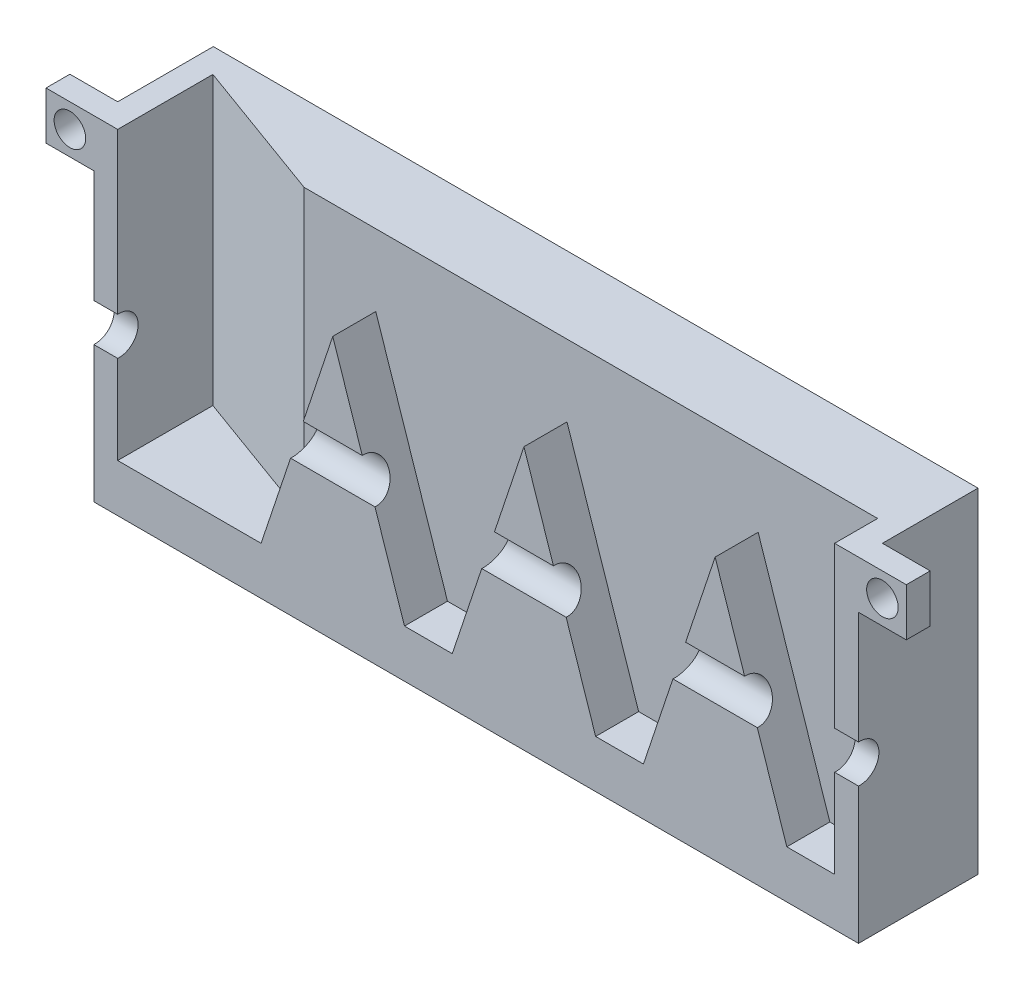
ISO-10303-21;
HEADER;
FILE_DESCRIPTION(('STEP AP214'),'2;1');
FILE_NAME('part.step','',(''),(''),'','','');
FILE_SCHEMA(('AUTOMOTIVE_DESIGN { 1 0 10303 214 1 1 1 1 }'));
ENDSEC;
DATA;
#1=APPLICATION_CONTEXT('core data for automotive mechanical design processes');
#2=APPLICATION_PROTOCOL_DEFINITION('international standard','automotive_design',2000,#1);
#3=PRODUCT_CONTEXT('',#1,'mechanical');
#4=PRODUCT('Part','Part','',(#3));
#5=PRODUCT_RELATED_PRODUCT_CATEGORY('part','',(#4));
#6=PRODUCT_DEFINITION_FORMATION('','',#4);
#7=PRODUCT_DEFINITION_CONTEXT('part definition',#1,'design');
#8=PRODUCT_DEFINITION('design','',#6,#7);
#9=PRODUCT_DEFINITION_SHAPE('','',#8);
#10=(LENGTH_UNIT() NAMED_UNIT(*) SI_UNIT(.MILLI.,.METRE.));
#11=(NAMED_UNIT(*) PLANE_ANGLE_UNIT() SI_UNIT($,.RADIAN.));
#12=(NAMED_UNIT(*) SI_UNIT($,.STERADIAN.) SOLID_ANGLE_UNIT());
#13=UNCERTAINTY_MEASURE_WITH_UNIT(LENGTH_MEASURE(1.E-05),#10,'distance_accuracy_value','');
#14=(GEOMETRIC_REPRESENTATION_CONTEXT(3) GLOBAL_UNCERTAINTY_ASSIGNED_CONTEXT((#13)) GLOBAL_UNIT_ASSIGNED_CONTEXT((#10,
#11,#12)) REPRESENTATION_CONTEXT('',''));
#15=CARTESIAN_POINT('',(0.,0.,0.));
#16=DIRECTION('',(0.,0.,1.));
#17=DIRECTION('',(1.,0.,0.));
#18=AXIS2_PLACEMENT_3D('',#15,#16,#17);
#19=CARTESIAN_POINT('',(0.,0.,-12.5));
#20=DIRECTION('',(0.,0.,-1.));
#21=DIRECTION('',(-1.,0.,0.));
#22=AXIS2_PLACEMENT_3D('',#19,#20,#21);
#23=PLANE('',#22);
#24=DIRECTION('',(-1.,0.,0.));
#25=VECTOR('',#24,1.);
#26=CARTESIAN_POINT('',(85.6568542494924,18.2453215446064,-12.5));
#27=LINE('',#26,#25);
#28=CARTESIAN_POINT('',(48.0848928184645,18.2453215446064,-12.5));
#29=VERTEX_POINT('',#28);
#30=CARTESIAN_POINT('',(41.9151071815355,18.2453215446064,-12.5));
#31=VERTEX_POINT('',#30);
#32=EDGE_CURVE('E438',#29,#31,#27,.T.);
#33=ORIENTED_EDGE('',*,*,#32,.F.);
#34=DIRECTION('',(0.316227766016838,-0.948683298050514,0.));
#35=VECTOR('',#34,1.);
#36=CARTESIAN_POINT('',(52.5,5.00000000000001,-12.5));
#37=LINE('',#36,#35);
#38=CARTESIAN_POINT('',(45.,27.5,-12.5));
#39=VERTEX_POINT('',#38);
#40=EDGE_CURVE('E462',#39,#29,#37,.T.);
#41=ORIENTED_EDGE('',*,*,#40,.F.);
#42=DIRECTION('',(0.316227766016838,0.948683298050514,0.));
#43=VECTOR('',#42,1.);
#44=CARTESIAN_POINT('',(45.,27.5,-12.5));
#45=LINE('',#44,#43);
#46=EDGE_CURVE('E454',#31,#39,#45,.T.);
#47=ORIENTED_EDGE('',*,*,#46,.F.);
#48=EDGE_LOOP('',(#33,#41,#47));
#49=FACE_BOUND('',#48,.T.);
#50=ADVANCED_FACE('F34',(#49),#23,.F.);
#51=DIRECTION('',(-1.,0.,0.));
#52=VECTOR('',#51,1.);
#53=CARTESIAN_POINT('',(85.6568542494924,18.2453215446064,-12.5));
#54=LINE('',#53,#52);
#55=CARTESIAN_POINT('',(28.0848928184645,18.2453215446064,-12.5));
#56=VERTEX_POINT('',#55);
#57=CARTESIAN_POINT('',(21.9151071815355,18.2453215446064,-12.5));
#58=VERTEX_POINT('',#57);
#59=EDGE_CURVE('E439',#56,#58,#54,.T.);
#60=ORIENTED_EDGE('',*,*,#59,.F.);
#61=DIRECTION('',(0.316227766016838,-0.948683298050514,0.));
#62=VECTOR('',#61,1.);
#63=CARTESIAN_POINT('',(32.5,5.00000000000001,-12.5));
#64=LINE('',#63,#62);
#65=CARTESIAN_POINT('',(25.,27.5,-12.5));
#66=VERTEX_POINT('',#65);
#67=EDGE_CURVE('E440',#66,#56,#64,.T.);
#68=ORIENTED_EDGE('',*,*,#67,.F.);
#69=DIRECTION('',(0.316227766016838,0.948683298050514,0.));
#70=VECTOR('',#69,1.);
#71=CARTESIAN_POINT('',(25.,27.5,-12.5));
#72=LINE('',#71,#70);
#73=EDGE_CURVE('E427',#58,#66,#72,.T.);
#74=ORIENTED_EDGE('',*,*,#73,.F.);
#75=EDGE_LOOP('',(#60,#68,#74));
#76=FACE_BOUND('',#75,.T.);
#77=ADVANCED_FACE('F532',(#76),#23,.F.);
#78=DIRECTION('',(-1.,0.,0.));
#79=VECTOR('',#78,1.);
#80=CARTESIAN_POINT('',(85.6568542494924,18.2453215446064,-12.5));
#81=LINE('',#80,#79);
#82=CARTESIAN_POINT('',(68.0848928184645,18.2453215446064,-12.5));
#83=VERTEX_POINT('',#82);
#84=CARTESIAN_POINT('',(61.9151071815355,18.2453215446064,-12.5));
#85=VERTEX_POINT('',#84);
#86=EDGE_CURVE('E435',#83,#85,#81,.T.);
#87=ORIENTED_EDGE('',*,*,#86,.F.);
#88=DIRECTION('',(0.316227766016838,-0.948683298050514,0.));
#89=VECTOR('',#88,1.);
#90=CARTESIAN_POINT('',(72.5,5.00000000000001,-12.5));
#91=LINE('',#90,#89);
#92=CARTESIAN_POINT('',(65.,27.5,-12.5));
#93=VERTEX_POINT('',#92);
#94=EDGE_CURVE('E455',#93,#83,#91,.T.);
#95=ORIENTED_EDGE('',*,*,#94,.F.);
#96=DIRECTION('',(0.316227766016838,0.948683298050514,0.));
#97=VECTOR('',#96,1.);
#98=CARTESIAN_POINT('',(65.,27.5,-12.5));
#99=LINE('',#98,#97);
#100=EDGE_CURVE('E457',#85,#93,#99,.T.);
#101=ORIENTED_EDGE('',*,*,#100,.F.);
#102=EDGE_LOOP('',(#87,#95,#101));
#103=FACE_BOUND('',#102,.T.);
#104=ADVANCED_FACE('F538',(#103),#23,.F.);
#105=CARTESIAN_POINT('',(82.5,32.5,-12.5));
#106=DIRECTION('',(0.,0.,-1.));
#107=DIRECTION('',(-1.,0.,0.));
#108=AXIS2_PLACEMENT_3D('',#105,#106,#107);
#109=CIRCLE('',#108,1.65);
#110=CARTESIAN_POINT('',(80.85,32.5,-12.5));
#111=VERTEX_POINT('',#110);
#112=EDGE_CURVE('E11',#111,#111,#109,.T.);
#113=ORIENTED_EDGE('',*,*,#112,.T.);
#114=EDGE_LOOP('',(#113));
#115=FACE_BOUND('',#114,.T.);
#116=DIRECTION('',(1.,0.,0.));
#117=VECTOR('',#116,1.);
#118=CARTESIAN_POINT('',(85.,30.,-12.5));
#119=LINE('',#118,#117);
#120=CARTESIAN_POINT('',(80.,30.,-12.5));
#121=VERTEX_POINT('',#120);
#122=CARTESIAN_POINT('',(85.,30.,-12.5));
#123=VERTEX_POINT('',#122);
#124=EDGE_CURVE('E416',#121,#123,#119,.T.);
#125=ORIENTED_EDGE('',*,*,#124,.T.);
#126=DIRECTION('',(0.,1.,0.));
#127=VECTOR('',#126,1.);
#128=CARTESIAN_POINT('',(85.,0.,-12.5));
#129=LINE('',#128,#127);
#130=CARTESIAN_POINT('',(85.,35.,-12.5));
#131=VERTEX_POINT('',#130);
#132=EDGE_CURVE('E43',#123,#131,#129,.T.);
#133=ORIENTED_EDGE('',*,*,#132,.T.);
#134=DIRECTION('',(1.,0.,0.));
#135=VECTOR('',#134,1.);
#136=CARTESIAN_POINT('',(0.,35.,-12.5));
#137=LINE('',#136,#135);
#138=CARTESIAN_POINT('',(77.5,35.,-12.5));
#139=VERTEX_POINT('',#138);
#140=EDGE_CURVE('E50',#139,#131,#137,.T.);
#141=ORIENTED_EDGE('',*,*,#140,.F.);
#142=DIRECTION('',(0.,-1.,0.));
#143=VECTOR('',#142,1.);
#144=CARTESIAN_POINT('',(77.5,5.00000000000001,-12.5));
#145=LINE('',#144,#143);
#146=CARTESIAN_POINT('',(77.5,18.2453215446064,-12.5));
#147=VERTEX_POINT('',#146);
#148=EDGE_CURVE('E445',#139,#147,#145,.T.);
#149=ORIENTED_EDGE('',*,*,#148,.T.);
#150=DIRECTION('',(-1.,0.,0.));
#151=VECTOR('',#150,1.);
#152=CARTESIAN_POINT('',(85.6568542494924,18.2453215446064,-12.5));
#153=LINE('',#152,#151);
#154=CARTESIAN_POINT('',(80.,18.2453215446064,-12.5));
#155=VERTEX_POINT('',#154);
#156=EDGE_CURVE('E401',#155,#147,#153,.T.);
#157=ORIENTED_EDGE('',*,*,#156,.F.);
#158=DIRECTION('',(0.,-1.,0.));
#159=VECTOR('',#158,1.);
#160=CARTESIAN_POINT('',(80.,35.,-12.5));
#161=LINE('',#160,#159);
#162=EDGE_CURVE('E430',#121,#155,#161,.T.);
#163=ORIENTED_EDGE('',*,*,#162,.F.);
#164=EDGE_LOOP('',(#125,#133,#141,#149,#157,#163));
#165=FACE_BOUND('',#164,.T.);
#166=ADVANCED_FACE('F551',(#115,#165),#23,.F.);
#167=DIRECTION('',(-1.,0.,0.));
#168=VECTOR('',#167,1.);
#169=CARTESIAN_POINT('',(77.5,5.00000000000001,-12.5));
#170=LINE('',#169,#168);
#171=CARTESIAN_POINT('',(57.5,5.00000000000001,-12.5));
#172=VERTEX_POINT('',#171);
#173=CARTESIAN_POINT('',(52.5,5.00000000000001,-12.5));
#174=VERTEX_POINT('',#173);
#175=EDGE_CURVE('E449',#172,#174,#170,.T.);
#176=ORIENTED_EDGE('',*,*,#175,.T.);
#177=CARTESIAN_POINT('',(49.4151071815355,14.2546784553936,-12.5));
#178=VERTEX_POINT('',#177);
#179=EDGE_CURVE('E420',#178,#174,#37,.T.);
#180=ORIENTED_EDGE('',*,*,#179,.F.);
#181=DIRECTION('',(-1.,0.,0.));
#182=VECTOR('',#181,1.);
#183=CARTESIAN_POINT('',(85.6568542494924,14.2546784553936,-12.5));
#184=LINE('',#183,#182);
#185=CARTESIAN_POINT('',(40.5848928184645,14.2546784553936,-12.5));
#186=VERTEX_POINT('',#185);
#187=EDGE_CURVE('E460',#186,#178,#184,.F.);
#188=ORIENTED_EDGE('',*,*,#187,.F.);
#189=CARTESIAN_POINT('',(37.5,5.00000000000001,-12.5));
#190=VERTEX_POINT('',#189);
#191=EDGE_CURVE('E452',#190,#186,#45,.T.);
#192=ORIENTED_EDGE('',*,*,#191,.F.);
#193=DIRECTION('',(-1.,0.,0.));
#194=VECTOR('',#193,1.);
#195=CARTESIAN_POINT('',(77.5,5.00000000000001,-12.5));
#196=LINE('',#195,#194);
#197=CARTESIAN_POINT('',(32.5,5.00000000000001,-12.5));
#198=VERTEX_POINT('',#197);
#199=EDGE_CURVE('E405',#190,#198,#196,.T.);
#200=ORIENTED_EDGE('',*,*,#199,.T.);
#201=CARTESIAN_POINT('',(29.4151071815355,14.2546784553936,-12.5));
#202=VERTEX_POINT('',#201);
#203=EDGE_CURVE('E442',#202,#198,#64,.T.);
#204=ORIENTED_EDGE('',*,*,#203,.F.);
#205=DIRECTION('',(-1.,0.,0.));
#206=VECTOR('',#205,1.);
#207=CARTESIAN_POINT('',(85.6568542494924,14.2546784553936,-12.5));
#208=LINE('',#207,#206);
#209=CARTESIAN_POINT('',(20.5848928184645,14.2546784553936,-12.5));
#210=VERTEX_POINT('',#209);
#211=EDGE_CURVE('E436',#210,#202,#208,.F.);
#212=ORIENTED_EDGE('',*,*,#211,.F.);
#213=CARTESIAN_POINT('',(17.5,5.00000000000001,-12.5));
#214=VERTEX_POINT('',#213);
#215=EDGE_CURVE('E424',#214,#210,#72,.T.);
#216=ORIENTED_EDGE('',*,*,#215,.F.);
#217=DIRECTION('',(-1.,0.,0.));
#218=VECTOR('',#217,1.);
#219=CARTESIAN_POINT('',(77.5,5.00000000000001,-12.5));
#220=LINE('',#219,#218);
#221=CARTESIAN_POINT('',(2.5,5.00000000000001,-12.5));
#222=VERTEX_POINT('',#221);
#223=EDGE_CURVE('E421',#214,#222,#220,.T.);
#224=ORIENTED_EDGE('',*,*,#223,.T.);
#225=DIRECTION('',(0.,1.,0.));
#226=VECTOR('',#225,1.);
#227=CARTESIAN_POINT('',(2.5,5.00000000000001,-12.5));
#228=LINE('',#227,#226);
#229=CARTESIAN_POINT('',(2.5,14.2546784553936,-12.5));
#230=VERTEX_POINT('',#229);
#231=EDGE_CURVE('E406',#222,#230,#228,.T.);
#232=ORIENTED_EDGE('',*,*,#231,.T.);
#233=DIRECTION('',(-1.,0.,0.));
#234=VECTOR('',#233,1.);
#235=CARTESIAN_POINT('',(85.6568542494924,14.2546784553936,-12.5));
#236=LINE('',#235,#234);
#237=CARTESIAN_POINT('',(0.,14.2546784553936,-12.5));
#238=VERTEX_POINT('',#237);
#239=EDGE_CURVE('E399',#238,#230,#236,.F.);
#240=ORIENTED_EDGE('',*,*,#239,.F.);
#241=DIRECTION('',(0.,1.,0.));
#242=VECTOR('',#241,1.);
#243=CARTESIAN_POINT('',(0.,35.,-12.5));
#244=LINE('',#243,#242);
#245=CARTESIAN_POINT('',(0.,0.,-12.5));
#246=VERTEX_POINT('',#245);
#247=EDGE_CURVE('E410',#246,#238,#244,.T.);
#248=ORIENTED_EDGE('',*,*,#247,.F.);
#249=DIRECTION('',(1.,0.,0.));
#250=VECTOR('',#249,1.);
#251=CARTESIAN_POINT('',(0.,0.,-12.5));
#252=LINE('',#251,#250);
#253=CARTESIAN_POINT('',(80.,0.,-12.5));
#254=VERTEX_POINT('',#253);
#255=EDGE_CURVE('E412',#246,#254,#252,.T.);
#256=ORIENTED_EDGE('',*,*,#255,.T.);
#257=CARTESIAN_POINT('',(80.,14.2546784553936,-12.5));
#258=VERTEX_POINT('',#257);
#259=EDGE_CURVE('E432',#258,#254,#161,.T.);
#260=ORIENTED_EDGE('',*,*,#259,.F.);
#261=DIRECTION('',(-1.,0.,0.));
#262=VECTOR('',#261,1.);
#263=CARTESIAN_POINT('',(85.6568542494924,14.2546784553936,-12.5));
#264=LINE('',#263,#262);
#265=CARTESIAN_POINT('',(77.5,14.2546784553936,-12.5));
#266=VERTEX_POINT('',#265);
#267=EDGE_CURVE('E433',#266,#258,#264,.F.);
#268=ORIENTED_EDGE('',*,*,#267,.F.);
#269=CARTESIAN_POINT('',(77.5,5.00000000000001,-12.5));
#270=VERTEX_POINT('',#269);
#271=EDGE_CURVE('E417',#266,#270,#145,.T.);
#272=ORIENTED_EDGE('',*,*,#271,.T.);
#273=DIRECTION('',(-1.,0.,0.));
#274=VECTOR('',#273,1.);
#275=CARTESIAN_POINT('',(77.5,5.00000000000001,-12.5));
#276=LINE('',#275,#274);
#277=CARTESIAN_POINT('',(72.5,5.00000000000001,-12.5));
#278=VERTEX_POINT('',#277);
#279=EDGE_CURVE('E446',#270,#278,#276,.T.);
#280=ORIENTED_EDGE('',*,*,#279,.T.);
#281=CARTESIAN_POINT('',(69.4151071815355,14.2546784553936,-12.5));
#282=VERTEX_POINT('',#281);
#283=EDGE_CURVE('E426',#282,#278,#91,.T.);
#284=ORIENTED_EDGE('',*,*,#283,.F.);
#285=DIRECTION('',(-1.,0.,0.));
#286=VECTOR('',#285,1.);
#287=CARTESIAN_POINT('',(85.6568542494924,14.2546784553936,-12.5));
#288=LINE('',#287,#286);
#289=CARTESIAN_POINT('',(60.5848928184645,14.2546784553936,-12.5));
#290=VERTEX_POINT('',#289);
#291=EDGE_CURVE('E458',#290,#282,#288,.F.);
#292=ORIENTED_EDGE('',*,*,#291,.F.);
#293=EDGE_CURVE('E464',#172,#290,#99,.T.);
#294=ORIENTED_EDGE('',*,*,#293,.F.);
#295=EDGE_LOOP('',(#176,#180,#188,#192,#200,#204,#212,#216,#224,#232,#240,#248,#256,#260,#268,
#272,#280,#284,#292,#294));
#296=FACE_BOUND('',#295,.T.);
#297=ADVANCED_FACE('F36',(#296),#23,.F.);
#298=CARTESIAN_POINT('',(0.,18.2453215446064,-12.5));
#299=VERTEX_POINT('',#298);
#300=CARTESIAN_POINT('',(0.,30.,-12.5));
#301=VERTEX_POINT('',#300);
#302=EDGE_CURVE('E409',#299,#301,#244,.T.);
#303=ORIENTED_EDGE('',*,*,#302,.F.);
#304=DIRECTION('',(-1.,0.,0.));
#305=VECTOR('',#304,1.);
#306=CARTESIAN_POINT('',(85.6568542494924,18.2453215446064,-12.5));
#307=LINE('',#306,#305);
#308=CARTESIAN_POINT('',(2.5,18.2453215446064,-12.5));
#309=VERTEX_POINT('',#308);
#310=EDGE_CURVE('E392',#309,#299,#307,.T.);
#311=ORIENTED_EDGE('',*,*,#310,.F.);
#312=CARTESIAN_POINT('',(2.5,35.,-12.5));
#313=VERTEX_POINT('',#312);
#314=EDGE_CURVE('E402',#309,#313,#228,.T.);
#315=ORIENTED_EDGE('',*,*,#314,.T.);
#316=CARTESIAN_POINT('',(-5.,35.,-12.5));
#317=VERTEX_POINT('',#316);
#318=EDGE_CURVE('E407',#317,#313,#137,.T.);
#319=ORIENTED_EDGE('',*,*,#318,.F.);
#320=DIRECTION('',(0.,-1.,0.));
#321=VECTOR('',#320,1.);
#322=CARTESIAN_POINT('',(-5.,0.,-12.5));
#323=LINE('',#322,#321);
#324=CARTESIAN_POINT('',(-5.,30.,-12.5));
#325=VERTEX_POINT('',#324);
#326=EDGE_CURVE('E413',#317,#325,#323,.T.);
#327=ORIENTED_EDGE('',*,*,#326,.T.);
#328=DIRECTION('',(-1.,0.,0.));
#329=VECTOR('',#328,1.);
#330=CARTESIAN_POINT('',(-5.,30.,-12.5));
#331=LINE('',#330,#329);
#332=EDGE_CURVE('E418',#301,#325,#331,.T.);
#333=ORIENTED_EDGE('',*,*,#332,.F.);
#334=EDGE_LOOP('',(#303,#311,#315,#319,#327,#333));
#335=FACE_BOUND('',#334,.T.);
#336=CARTESIAN_POINT('',(-2.5,32.5,-12.5));
#337=DIRECTION('',(0.,0.,-1.));
#338=DIRECTION('',(-1.,0.,0.));
#339=AXIS2_PLACEMENT_3D('',#336,#337,#338);
#340=CIRCLE('',#339,1.65);
#341=CARTESIAN_POINT('',(-4.15,32.5,-12.5));
#342=VERTEX_POINT('',#341);
#343=EDGE_CURVE('E38',#342,#342,#340,.F.);
#344=ORIENTED_EDGE('',*,*,#343,.F.);
#345=EDGE_LOOP('',(#344));
#346=FACE_BOUND('',#345,.T.);
#347=ADVANCED_FACE('F533',(#335,#346),#23,.F.);
#348=CARTESIAN_POINT('',(0.,35.,-25.));
#349=DIRECTION('',(0.,0.,1.));
#350=DIRECTION('',(1.,0.,0.));
#351=AXIS2_PLACEMENT_3D('',#348,#349,#350);
#352=PLANE('',#351);
#353=DIRECTION('',(-1.,0.,0.));
#354=VECTOR('',#353,1.);
#355=CARTESIAN_POINT('',(0.,0.,-25.));
#356=LINE('',#355,#354);
#357=CARTESIAN_POINT('',(80.,0.,-25.));
#358=VERTEX_POINT('',#357);
#359=CARTESIAN_POINT('',(0.,0.,-25.));
#360=VERTEX_POINT('',#359);
#361=EDGE_CURVE('E377',#358,#360,#356,.T.);
#362=ORIENTED_EDGE('',*,*,#361,.T.);
#363=DIRECTION('',(0.,-1.,0.));
#364=VECTOR('',#363,1.);
#365=CARTESIAN_POINT('',(0.,35.,-25.));
#366=LINE('',#365,#364);
#367=CARTESIAN_POINT('',(0.,35.,-25.));
#368=VERTEX_POINT('',#367);
#369=EDGE_CURVE('E381',#368,#360,#366,.T.);
#370=ORIENTED_EDGE('',*,*,#369,.F.);
#371=DIRECTION('',(-1.,0.,0.));
#372=VECTOR('',#371,1.);
#373=CARTESIAN_POINT('',(0.,35.,-25.));
#374=LINE('',#373,#372);
#375=CARTESIAN_POINT('',(80.,35.,-25.));
#376=VERTEX_POINT('',#375);
#377=EDGE_CURVE('E379',#376,#368,#374,.T.);
#378=ORIENTED_EDGE('',*,*,#377,.F.);
#379=DIRECTION('',(0.,-1.,0.));
#380=VECTOR('',#379,1.);
#381=CARTESIAN_POINT('',(80.,35.,-25.));
#382=LINE('',#381,#380);
#383=EDGE_CURVE('E389',#376,#358,#382,.T.);
#384=ORIENTED_EDGE('',*,*,#383,.T.);
#385=EDGE_LOOP('',(#362,#370,#378,#384));
#386=FACE_BOUND('',#385,.T.);
#387=ADVANCED_FACE('F541',(#386),#352,.F.);
#388=CARTESIAN_POINT('',(17.5,50.9626665871387,-17.));
#389=DIRECTION('',(-0.342020143325663,0.,0.939692620785911));
#390=DIRECTION('',(0.939692620785911,0.,0.342020143325663));
#391=AXIS2_PLACEMENT_3D('',#388,#389,#390);
#392=PLANE('',#391);
#393=DIRECTION('',(0.,-1.,0.));
#394=VECTOR('',#393,1.);
#395=CARTESIAN_POINT('',(2.5,50.9626665871387,-22.4595535139929));
#396=LINE('',#395,#394);
#397=CARTESIAN_POINT('',(2.5,35.,-22.4595535139929));
#398=VERTEX_POINT('',#397);
#399=CARTESIAN_POINT('',(2.5,5.00000000000001,-22.4595535139929));
#400=VERTEX_POINT('',#399);
#401=EDGE_CURVE('E313',#398,#400,#396,.T.);
#402=ORIENTED_EDGE('',*,*,#401,.T.);
#403=DIRECTION('',(-0.939692620785911,0.,-0.342020143325663));
#404=VECTOR('',#403,1.);
#405=CARTESIAN_POINT('',(17.5,5.00000000000001,-17.));
#406=LINE('',#405,#404);
#407=CARTESIAN_POINT('',(17.5,5.00000000000001,-17.));
#408=VERTEX_POINT('',#407);
#409=EDGE_CURVE('E305',#408,#400,#406,.T.);
#410=ORIENTED_EDGE('',*,*,#409,.F.);
#411=DIRECTION('',(0.,-1.,0.));
#412=VECTOR('',#411,1.);
#413=CARTESIAN_POINT('',(17.5,50.9626665871387,-17.));
#414=LINE('',#413,#412);
#415=CARTESIAN_POINT('',(17.5,35.,-17.));
#416=VERTEX_POINT('',#415);
#417=EDGE_CURVE('E310',#416,#408,#414,.T.);
#418=ORIENTED_EDGE('',*,*,#417,.F.);
#419=DIRECTION('',(0.939692620785911,0.,0.342020143325663));
#420=VECTOR('',#419,1.);
#421=CARTESIAN_POINT('',(17.5,35.,-17.));
#422=LINE('',#421,#420);
#423=EDGE_CURVE('E306',#398,#416,#422,.T.);
#424=ORIENTED_EDGE('',*,*,#423,.F.);
#425=EDGE_LOOP('',(#402,#410,#418,#424));
#426=FACE_BOUND('',#425,.T.);
#427=ADVANCED_FACE('F548',(#426),#392,.T.);
#428=CARTESIAN_POINT('',(77.5,5.00000000000001,-5.));
#429=DIRECTION('',(0.,1.,0.));
#430=DIRECTION('',(-1.,0.,0.));
#431=AXIS2_PLACEMENT_3D('',#428,#429,#430);
#432=PLANE('',#431);
#433=ORIENTED_EDGE('',*,*,#223,.F.);
#434=DIRECTION('',(0.,0.,-1.));
#435=VECTOR('',#434,1.);
#436=CARTESIAN_POINT('',(17.5,5.00000000000001,22.0416345659799));
#437=LINE('',#436,#435);
#438=EDGE_CURVE('E337',#214,#408,#437,.T.);
#439=ORIENTED_EDGE('',*,*,#438,.T.);
#440=ORIENTED_EDGE('',*,*,#409,.T.);
#441=DIRECTION('',(0.,0.,-1.));
#442=VECTOR('',#441,1.);
#443=CARTESIAN_POINT('',(2.5,5.00000000000001,-5.));
#444=LINE('',#443,#442);
#445=EDGE_CURVE('E364',#222,#400,#444,.T.);
#446=ORIENTED_EDGE('',*,*,#445,.F.);
#447=EDGE_LOOP('',(#433,#439,#440,#446));
#448=FACE_BOUND('',#447,.T.);
#449=ADVANCED_FACE('F670',(#448),#432,.T.);
#450=ORIENTED_EDGE('',*,*,#199,.F.);
#451=DIRECTION('',(0.,0.,-1.));
#452=VECTOR('',#451,1.);
#453=CARTESIAN_POINT('',(37.5,5.00000000000001,22.0416345659799));
#454=LINE('',#453,#452);
#455=CARTESIAN_POINT('',(37.5,5.00000000000001,-17.));
#456=VERTEX_POINT('',#455);
#457=EDGE_CURVE('E325',#190,#456,#454,.T.);
#458=ORIENTED_EDGE('',*,*,#457,.T.);
#459=DIRECTION('',(1.,0.,0.));
#460=VECTOR('',#459,1.);
#461=CARTESIAN_POINT('',(77.5,5.00000000000001,-17.));
#462=LINE('',#461,#460);
#463=CARTESIAN_POINT('',(32.5,5.00000000000001,-17.));
#464=VERTEX_POINT('',#463);
#465=EDGE_CURVE('E357',#464,#456,#462,.T.);
#466=ORIENTED_EDGE('',*,*,#465,.F.);
#467=DIRECTION('',(0.,0.,-1.));
#468=VECTOR('',#467,1.);
#469=CARTESIAN_POINT('',(32.5,5.00000000000001,22.0416345659799));
#470=LINE('',#469,#468);
#471=EDGE_CURVE('E322',#198,#464,#470,.T.);
#472=ORIENTED_EDGE('',*,*,#471,.F.);
#473=EDGE_LOOP('',(#450,#458,#466,#472));
#474=FACE_BOUND('',#473,.T.);
#475=ADVANCED_FACE('F652',(#474),#432,.T.);
#476=CARTESIAN_POINT('',(77.5,5.00000000000001,-17.));
#477=DIRECTION('',(0.,0.,-1.));
#478=DIRECTION('',(-1.,0.,0.));
#479=AXIS2_PLACEMENT_3D('',#476,#477,#478);
#480=PLANE('',#479);
#481=ORIENTED_EDGE('',*,*,#417,.T.);
#482=DIRECTION('',(-0.316227766016838,-0.948683298050514,0.));
#483=VECTOR('',#482,1.);
#484=CARTESIAN_POINT('',(25.,27.5,-17.));
#485=LINE('',#484,#483);
#486=CARTESIAN_POINT('',(25.,27.5,-17.));
#487=VERTEX_POINT('',#486);
#488=EDGE_CURVE('E334',#487,#408,#485,.T.);
#489=ORIENTED_EDGE('',*,*,#488,.F.);
#490=DIRECTION('',(-0.316227766016838,0.948683298050514,0.));
#491=VECTOR('',#490,1.);
#492=CARTESIAN_POINT('',(32.5,5.00000000000001,-17.));
#493=LINE('',#492,#491);
#494=EDGE_CURVE('E309',#464,#487,#493,.T.);
#495=ORIENTED_EDGE('',*,*,#494,.F.);
#496=ORIENTED_EDGE('',*,*,#465,.T.);
#497=DIRECTION('',(-0.316227766016838,-0.948683298050514,0.));
#498=VECTOR('',#497,1.);
#499=CARTESIAN_POINT('',(45.,27.5,-17.));
#500=LINE('',#499,#498);
#501=CARTESIAN_POINT('',(45.,27.5,-17.));
#502=VERTEX_POINT('',#501);
#503=EDGE_CURVE('E321',#502,#456,#500,.T.);
#504=ORIENTED_EDGE('',*,*,#503,.F.);
#505=DIRECTION('',(-0.316227766016838,0.948683298050514,0.));
#506=VECTOR('',#505,1.);
#507=CARTESIAN_POINT('',(52.5,5.00000000000001,-17.));
#508=LINE('',#507,#506);
#509=CARTESIAN_POINT('',(52.5,5.00000000000001,-17.));
#510=VERTEX_POINT('',#509);
#511=EDGE_CURVE('E318',#510,#502,#508,.T.);
#512=ORIENTED_EDGE('',*,*,#511,.F.);
#513=CARTESIAN_POINT('',(57.5,5.00000000000001,-17.));
#514=VERTEX_POINT('',#513);
#515=EDGE_CURVE('E354',#510,#514,#462,.T.);
#516=ORIENTED_EDGE('',*,*,#515,.T.);
#517=DIRECTION('',(-0.316227766016838,-0.948683298050514,0.));
#518=VECTOR('',#517,1.);
#519=CARTESIAN_POINT('',(65.,27.5,-17.));
#520=LINE('',#519,#518);
#521=CARTESIAN_POINT('',(65.,27.5,-17.));
#522=VERTEX_POINT('',#521);
#523=EDGE_CURVE('E344',#522,#514,#520,.T.);
#524=ORIENTED_EDGE('',*,*,#523,.F.);
#525=DIRECTION('',(-0.316227766016838,0.948683298050514,0.));
#526=VECTOR('',#525,1.);
#527=CARTESIAN_POINT('',(72.5,5.00000000000001,-17.));
#528=LINE('',#527,#526);
#529=CARTESIAN_POINT('',(72.5,5.00000000000001,-17.));
#530=VERTEX_POINT('',#529);
#531=EDGE_CURVE('E331',#530,#522,#528,.T.);
#532=ORIENTED_EDGE('',*,*,#531,.F.);
#533=CARTESIAN_POINT('',(77.5,5.00000000000001,-17.));
#534=VERTEX_POINT('',#533);
#535=EDGE_CURVE('E353',#530,#534,#462,.T.);
#536=ORIENTED_EDGE('',*,*,#535,.T.);
#537=DIRECTION('',(0.,1.,0.));
#538=VECTOR('',#537,1.);
#539=CARTESIAN_POINT('',(77.5,5.00000000000001,-17.));
#540=LINE('',#539,#538);
#541=CARTESIAN_POINT('',(77.5,35.,-17.));
#542=VERTEX_POINT('',#541);
#543=EDGE_CURVE('E358',#534,#542,#540,.T.);
#544=ORIENTED_EDGE('',*,*,#543,.T.);
#545=DIRECTION('',(-1.,0.,0.));
#546=VECTOR('',#545,1.);
#547=CARTESIAN_POINT('',(77.5,35.,-17.));
#548=LINE('',#547,#546);
#549=EDGE_CURVE('E361',#542,#416,#548,.T.);
#550=ORIENTED_EDGE('',*,*,#549,.T.);
#551=EDGE_LOOP('',(#481,#489,#495,#496,#504,#512,#516,#524,#532,#536,#544,#550));
#552=FACE_BOUND('',#551,.T.);
#553=ADVANCED_FACE('F627',(#552),#480,.F.);
#554=ORIENTED_EDGE('',*,*,#175,.F.);
#555=DIRECTION('',(0.,0.,-1.));
#556=VECTOR('',#555,1.);
#557=CARTESIAN_POINT('',(57.5,5.00000000000001,22.0416345659799));
#558=LINE('',#557,#556);
#559=EDGE_CURVE('E347',#172,#514,#558,.T.);
#560=ORIENTED_EDGE('',*,*,#559,.T.);
#561=ORIENTED_EDGE('',*,*,#515,.F.);
#562=DIRECTION('',(0.,0.,-1.));
#563=VECTOR('',#562,1.);
#564=CARTESIAN_POINT('',(52.5,5.00000000000001,22.0416345659799));
#565=LINE('',#564,#563);
#566=EDGE_CURVE('E329',#174,#510,#565,.T.);
#567=ORIENTED_EDGE('',*,*,#566,.F.);
#568=EDGE_LOOP('',(#554,#560,#561,#567));
#569=FACE_BOUND('',#568,.T.);
#570=ADVANCED_FACE('F643',(#569),#432,.T.);
#571=CARTESIAN_POINT('',(52.5,5.00000000000001,22.0416345659799));
#572=DIRECTION('',(-0.948683298050514,-0.316227766016838,0.));
#573=DIRECTION('',(0.316227766016838,-0.948683298050514,0.));
#574=AXIS2_PLACEMENT_3D('',#571,#572,#573);
#575=PLANE('',#574);
#576=DIRECTION('',(0.,0.,-1.));
#577=VECTOR('',#576,1.);
#578=CARTESIAN_POINT('',(45.,27.5,22.0416345659799));
#579=LINE('',#578,#577);
#580=EDGE_CURVE('E327',#39,#502,#579,.T.);
#581=ORIENTED_EDGE('',*,*,#580,.F.);
#582=ORIENTED_EDGE('',*,*,#40,.T.);
#583=CARTESIAN_POINT('',(48.75,16.25,-12.6367184465588));
#584=DIRECTION('',(-0.948683298050514,-0.316227766016838,0.));
#585=DIRECTION('',(-0.316227766016838,0.948683298050514,0.));
#586=AXIS2_PLACEMENT_3D('',#583,#584,#585);
#587=ELLIPSE('',#586,2.10818510677892,2.);
#588=EDGE_CURVE('E393',#29,#178,#587,.T.);
#589=ORIENTED_EDGE('',*,*,#588,.T.);
#590=ORIENTED_EDGE('',*,*,#179,.T.);
#591=ORIENTED_EDGE('',*,*,#566,.T.);
#592=ORIENTED_EDGE('',*,*,#511,.T.);
#593=EDGE_LOOP('',(#581,#582,#589,#590,#591,#592));
#594=FACE_BOUND('',#593,.T.);
#595=ADVANCED_FACE('F646',(#594),#575,.F.);
#596=CARTESIAN_POINT('',(45.,27.5,22.0416345659799));
#597=DIRECTION('',(0.948683298050514,-0.316227766016838,0.));
#598=DIRECTION('',(0.316227766016838,0.948683298050514,0.));
#599=AXIS2_PLACEMENT_3D('',#596,#597,#598);
#600=PLANE('',#599);
#601=ORIENTED_EDGE('',*,*,#457,.F.);
#602=ORIENTED_EDGE('',*,*,#191,.T.);
#603=CARTESIAN_POINT('',(41.25,16.25,-12.6367184465588));
#604=DIRECTION('',(0.948683298050514,-0.316227766016838,0.));
#605=DIRECTION('',(-0.316227766016838,-0.948683298050514,0.));
#606=AXIS2_PLACEMENT_3D('',#603,#604,#605);
#607=ELLIPSE('',#606,2.10818510677892,2.);
#608=EDGE_CURVE('E396',#186,#31,#607,.T.);
#609=ORIENTED_EDGE('',*,*,#608,.T.);
#610=ORIENTED_EDGE('',*,*,#46,.T.);
#611=ORIENTED_EDGE('',*,*,#580,.T.);
#612=ORIENTED_EDGE('',*,*,#503,.T.);
#613=EDGE_LOOP('',(#601,#602,#609,#610,#611,#612));
#614=FACE_BOUND('',#613,.T.);
#615=ADVANCED_FACE('F486',(#614),#600,.F.);
#616=CARTESIAN_POINT('',(85.6568542494924,16.25,-12.6367184465588));
#617=DIRECTION('',(-1.,0.,0.));
#618=DIRECTION('',(0.,0.,1.));
#619=AXIS2_PLACEMENT_3D('',#616,#617,#618);
#620=CYLINDRICAL_SURFACE('',#619,2.);
#621=ORIENTED_EDGE('',*,*,#608,.F.);
#622=ORIENTED_EDGE('',*,*,#187,.T.);
#623=ORIENTED_EDGE('',*,*,#588,.F.);
#624=ORIENTED_EDGE('',*,*,#32,.T.);
#625=EDGE_LOOP('',(#621,#622,#623,#624));
#626=FACE_BOUND('',#625,.T.);
#627=ADVANCED_FACE('F481',(#626),#620,.F.);
#628=CARTESIAN_POINT('',(32.5,5.00000000000001,22.0416345659799));
#629=DIRECTION('',(-0.948683298050514,-0.316227766016838,0.));
#630=DIRECTION('',(0.316227766016838,-0.948683298050514,0.));
#631=AXIS2_PLACEMENT_3D('',#628,#629,#630);
#632=PLANE('',#631);
#633=DIRECTION('',(0.,0.,-1.));
#634=VECTOR('',#633,1.);
#635=CARTESIAN_POINT('',(25.,27.5,22.0416345659799));
#636=LINE('',#635,#634);
#637=EDGE_CURVE('E339',#66,#487,#636,.T.);
#638=ORIENTED_EDGE('',*,*,#637,.F.);
#639=ORIENTED_EDGE('',*,*,#67,.T.);
#640=CARTESIAN_POINT('',(28.75,16.25,-12.6367184465588));
#641=DIRECTION('',(-0.948683298050514,-0.316227766016838,0.));
#642=DIRECTION('',(-0.316227766016838,0.948683298050514,0.));
#643=AXIS2_PLACEMENT_3D('',#640,#641,#642);
#644=ELLIPSE('',#643,2.10818510677892,2.);
#645=EDGE_CURVE('E489',#56,#202,#644,.T.);
#646=ORIENTED_EDGE('',*,*,#645,.T.);
#647=ORIENTED_EDGE('',*,*,#203,.T.);
#648=ORIENTED_EDGE('',*,*,#471,.T.);
#649=ORIENTED_EDGE('',*,*,#494,.T.);
#650=EDGE_LOOP('',(#638,#639,#646,#647,#648,#649));
#651=FACE_BOUND('',#650,.T.);
#652=ADVANCED_FACE('F661',(#651),#632,.F.);
#653=CARTESIAN_POINT('',(25.,27.5,22.0416345659799));
#654=DIRECTION('',(0.948683298050514,-0.316227766016838,0.));
#655=DIRECTION('',(0.316227766016838,0.948683298050514,0.));
#656=AXIS2_PLACEMENT_3D('',#653,#654,#655);
#657=PLANE('',#656);
#658=ORIENTED_EDGE('',*,*,#438,.F.);
#659=ORIENTED_EDGE('',*,*,#215,.T.);
#660=CARTESIAN_POINT('',(21.25,16.25,-12.6367184465588));
#661=DIRECTION('',(0.948683298050514,-0.316227766016838,0.));
#662=DIRECTION('',(-0.316227766016838,-0.948683298050514,0.));
#663=AXIS2_PLACEMENT_3D('',#660,#661,#662);
#664=ELLIPSE('',#663,2.10818510677892,2.);
#665=EDGE_CURVE('E492',#210,#58,#664,.T.);
#666=ORIENTED_EDGE('',*,*,#665,.T.);
#667=ORIENTED_EDGE('',*,*,#73,.T.);
#668=ORIENTED_EDGE('',*,*,#637,.T.);
#669=ORIENTED_EDGE('',*,*,#488,.T.);
#670=EDGE_LOOP('',(#658,#659,#666,#667,#668,#669));
#671=FACE_BOUND('',#670,.T.);
#672=ADVANCED_FACE('F667',(#671),#657,.F.);
#673=ORIENTED_EDGE('',*,*,#665,.F.);
#674=ORIENTED_EDGE('',*,*,#211,.T.);
#675=ORIENTED_EDGE('',*,*,#645,.F.);
#676=ORIENTED_EDGE('',*,*,#59,.T.);
#677=EDGE_LOOP('',(#673,#674,#675,#676));
#678=FACE_BOUND('',#677,.T.);
#679=ADVANCED_FACE('F582',(#678),#620,.F.);
#680=ORIENTED_EDGE('',*,*,#279,.F.);
#681=DIRECTION('',(0.,0.,-1.));
#682=VECTOR('',#681,1.);
#683=CARTESIAN_POINT('',(77.5,5.00000000000001,-5.));
#684=LINE('',#683,#682);
#685=EDGE_CURVE('E370',#270,#534,#684,.T.);
#686=ORIENTED_EDGE('',*,*,#685,.T.);
#687=ORIENTED_EDGE('',*,*,#535,.F.);
#688=DIRECTION('',(0.,0.,-1.));
#689=VECTOR('',#688,1.);
#690=CARTESIAN_POINT('',(72.5,5.00000000000001,22.0416345659799));
#691=LINE('',#690,#689);
#692=EDGE_CURVE('E351',#278,#530,#691,.T.);
#693=ORIENTED_EDGE('',*,*,#692,.F.);
#694=EDGE_LOOP('',(#680,#686,#687,#693));
#695=FACE_BOUND('',#694,.T.);
#696=ADVANCED_FACE('F619',(#695),#432,.T.);
#697=CARTESIAN_POINT('',(72.5,5.00000000000001,22.0416345659799));
#698=DIRECTION('',(-0.948683298050514,-0.316227766016838,0.));
#699=DIRECTION('',(0.316227766016838,-0.948683298050514,0.));
#700=AXIS2_PLACEMENT_3D('',#697,#698,#699);
#701=PLANE('',#700);
#702=DIRECTION('',(0.,0.,-1.));
#703=VECTOR('',#702,1.);
#704=CARTESIAN_POINT('',(65.,27.5,22.0416345659799));
#705=LINE('',#704,#703);
#706=EDGE_CURVE('E349',#93,#522,#705,.T.);
#707=ORIENTED_EDGE('',*,*,#706,.F.);
#708=ORIENTED_EDGE('',*,*,#94,.T.);
#709=CARTESIAN_POINT('',(68.75,16.25,-12.6367184465588));
#710=DIRECTION('',(-0.948683298050514,-0.316227766016838,0.));
#711=DIRECTION('',(-0.316227766016838,0.948683298050514,0.));
#712=AXIS2_PLACEMENT_3D('',#709,#710,#711);
#713=ELLIPSE('',#712,2.10818510677892,2.);
#714=EDGE_CURVE('E499',#83,#282,#713,.T.);
#715=ORIENTED_EDGE('',*,*,#714,.T.);
#716=ORIENTED_EDGE('',*,*,#283,.T.);
#717=ORIENTED_EDGE('',*,*,#692,.T.);
#718=ORIENTED_EDGE('',*,*,#531,.T.);
#719=EDGE_LOOP('',(#707,#708,#715,#716,#717,#718));
#720=FACE_BOUND('',#719,.T.);
#721=ADVANCED_FACE('F624',(#720),#701,.F.);
#722=CARTESIAN_POINT('',(65.,27.5,22.0416345659799));
#723=DIRECTION('',(0.948683298050514,-0.316227766016838,0.));
#724=DIRECTION('',(0.316227766016838,0.948683298050514,0.));
#725=AXIS2_PLACEMENT_3D('',#722,#723,#724);
#726=PLANE('',#725);
#727=ORIENTED_EDGE('',*,*,#559,.F.);
#728=ORIENTED_EDGE('',*,*,#293,.T.);
#729=CARTESIAN_POINT('',(61.25,16.25,-12.6367184465588));
#730=DIRECTION('',(0.948683298050514,-0.316227766016838,0.));
#731=DIRECTION('',(-0.316227766016838,-0.948683298050514,0.));
#732=AXIS2_PLACEMENT_3D('',#729,#730,#731);
#733=ELLIPSE('',#732,2.10818510677892,2.);
#734=EDGE_CURVE('E502',#290,#85,#733,.T.);
#735=ORIENTED_EDGE('',*,*,#734,.T.);
#736=ORIENTED_EDGE('',*,*,#100,.T.);
#737=ORIENTED_EDGE('',*,*,#706,.T.);
#738=ORIENTED_EDGE('',*,*,#523,.T.);
#739=EDGE_LOOP('',(#727,#728,#735,#736,#737,#738));
#740=FACE_BOUND('',#739,.T.);
#741=ADVANCED_FACE('F632',(#740),#726,.F.);
#742=ORIENTED_EDGE('',*,*,#734,.F.);
#743=ORIENTED_EDGE('',*,*,#291,.T.);
#744=ORIENTED_EDGE('',*,*,#714,.F.);
#745=ORIENTED_EDGE('',*,*,#86,.T.);
#746=EDGE_LOOP('',(#742,#743,#744,#745));
#747=FACE_BOUND('',#746,.T.);
#748=ADVANCED_FACE('F583',(#747),#620,.F.);
#749=CARTESIAN_POINT('',(2.5,5.00000000000001,-5.));
#750=DIRECTION('',(1.,0.,0.));
#751=DIRECTION('',(0.,1.,0.));
#752=AXIS2_PLACEMENT_3D('',#749,#750,#751);
#753=PLANE('',#752);
#754=ORIENTED_EDGE('',*,*,#231,.F.);
#755=ORIENTED_EDGE('',*,*,#445,.T.);
#756=ORIENTED_EDGE('',*,*,#401,.F.);
#757=DIRECTION('',(0.,0.,-1.));
#758=VECTOR('',#757,1.);
#759=CARTESIAN_POINT('',(2.5,35.,-5.));
#760=LINE('',#759,#758);
#761=EDGE_CURVE('E366',#313,#398,#760,.T.);
#762=ORIENTED_EDGE('',*,*,#761,.F.);
#763=ORIENTED_EDGE('',*,*,#314,.F.);
#764=CARTESIAN_POINT('',(2.5,16.25,-12.6367184465588));
#765=DIRECTION('',(1.,0.,0.));
#766=DIRECTION('',(0.,0.,-1.));
#767=AXIS2_PLACEMENT_3D('',#764,#765,#766);
#768=CIRCLE('',#767,2.);
#769=EDGE_CURVE('E507',#230,#309,#768,.T.);
#770=ORIENTED_EDGE('',*,*,#769,.F.);
#771=EDGE_LOOP('',(#754,#755,#756,#762,#763,#770));
#772=FACE_BOUND('',#771,.T.);
#773=ADVANCED_FACE('F575',(#772),#753,.T.);
#774=CARTESIAN_POINT('',(0.,35.,0.));
#775=DIRECTION('',(1.,0.,0.));
#776=DIRECTION('',(0.,0.,-1.));
#777=AXIS2_PLACEMENT_3D('',#774,#775,#776);
#778=PLANE('',#777);
#779=DIRECTION('',(0.,0.,1.));
#780=VECTOR('',#779,1.);
#781=CARTESIAN_POINT('',(0.,0.,0.));
#782=LINE('',#781,#780);
#783=EDGE_CURVE('E372',#360,#246,#782,.T.);
#784=ORIENTED_EDGE('',*,*,#783,.T.);
#785=ORIENTED_EDGE('',*,*,#247,.T.);
#786=CARTESIAN_POINT('',(0.,16.25,-12.6367184465588));
#787=DIRECTION('',(-1.,0.,0.));
#788=DIRECTION('',(0.,0.,1.));
#789=AXIS2_PLACEMENT_3D('',#786,#787,#788);
#790=CIRCLE('',#789,2.);
#791=EDGE_CURVE('E597',#299,#238,#790,.T.);
#792=ORIENTED_EDGE('',*,*,#791,.F.);
#793=ORIENTED_EDGE('',*,*,#302,.T.);
#794=DIRECTION('',(0.,0.,1.));
#795=VECTOR('',#794,1.);
#796=CARTESIAN_POINT('',(0.,30.,-15.));
#797=LINE('',#796,#795);
#798=CARTESIAN_POINT('',(0.,30.,-15.));
#799=VERTEX_POINT('',#798);
#800=EDGE_CURVE('E290',#799,#301,#797,.T.);
#801=ORIENTED_EDGE('',*,*,#800,.F.);
#802=DIRECTION('',(0.,-1.,0.));
#803=VECTOR('',#802,1.);
#804=CARTESIAN_POINT('',(0.,35.,-15.));
#805=LINE('',#804,#803);
#806=CARTESIAN_POINT('',(0.,35.,-15.));
#807=VERTEX_POINT('',#806);
#808=EDGE_CURVE('E285',#807,#799,#805,.T.);
#809=ORIENTED_EDGE('',*,*,#808,.F.);
#810=DIRECTION('',(0.,0.,1.));
#811=VECTOR('',#810,1.);
#812=CARTESIAN_POINT('',(0.,35.,0.));
#813=LINE('',#812,#811);
#814=EDGE_CURVE('E373',#368,#807,#813,.T.);
#815=ORIENTED_EDGE('',*,*,#814,.F.);
#816=ORIENTED_EDGE('',*,*,#369,.T.);
#817=EDGE_LOOP('',(#784,#785,#792,#793,#801,#809,#815,#816));
#818=FACE_BOUND('',#817,.T.);
#819=ADVANCED_FACE('F572',(#818),#778,.F.);
#820=ORIENTED_EDGE('',*,*,#791,.T.);
#821=ORIENTED_EDGE('',*,*,#239,.T.);
#822=ORIENTED_EDGE('',*,*,#769,.T.);
#823=ORIENTED_EDGE('',*,*,#310,.T.);
#824=EDGE_LOOP('',(#820,#821,#822,#823));
#825=FACE_BOUND('',#824,.T.);
#826=ADVANCED_FACE('F574',(#825),#620,.F.);
#827=CARTESIAN_POINT('',(-5.,30.,-15.));
#828=DIRECTION('',(0.,1.,0.));
#829=DIRECTION('',(0.,0.,1.));
#830=AXIS2_PLACEMENT_3D('',#827,#828,#829);
#831=PLANE('',#830);
#832=ORIENTED_EDGE('',*,*,#800,.T.);
#833=ORIENTED_EDGE('',*,*,#332,.T.);
#834=DIRECTION('',(0.,0.,1.));
#835=VECTOR('',#834,1.);
#836=CARTESIAN_POINT('',(-5.,30.,-15.));
#837=LINE('',#836,#835);
#838=CARTESIAN_POINT('',(-5.,30.,-15.));
#839=VERTEX_POINT('',#838);
#840=EDGE_CURVE('E289',#839,#325,#837,.T.);
#841=ORIENTED_EDGE('',*,*,#840,.F.);
#842=DIRECTION('',(1.,0.,0.));
#843=VECTOR('',#842,1.);
#844=CARTESIAN_POINT('',(-5.,30.,-15.));
#845=LINE('',#844,#843);
#846=EDGE_CURVE('E302',#839,#799,#845,.T.);
#847=ORIENTED_EDGE('',*,*,#846,.T.);
#848=EDGE_LOOP('',(#832,#833,#841,#847));
#849=FACE_BOUND('',#848,.T.);
#850=ADVANCED_FACE('F581',(#849),#831,.F.);
#851=CARTESIAN_POINT('',(-5.,35.,-15.));
#852=DIRECTION('',(0.,0.,1.));
#853=DIRECTION('',(1.,0.,0.));
#854=AXIS2_PLACEMENT_3D('',#851,#852,#853);
#855=PLANE('',#854);
#856=CARTESIAN_POINT('',(-2.5,32.5,-15.));
#857=DIRECTION('',(0.,0.,1.));
#858=DIRECTION('',(1.,0.,0.));
#859=AXIS2_PLACEMENT_3D('',#856,#857,#858);
#860=CIRCLE('',#859,1.65);
#861=CARTESIAN_POINT('',(-0.850000000000001,32.5,-15.));
#862=VERTEX_POINT('',#861);
#863=EDGE_CURVE('E267',#862,#862,#860,.F.);
#864=ORIENTED_EDGE('',*,*,#863,.F.);
#865=EDGE_LOOP('',(#864));
#866=FACE_BOUND('',#865,.T.);
#867=ORIENTED_EDGE('',*,*,#808,.T.);
#868=ORIENTED_EDGE('',*,*,#846,.F.);
#869=DIRECTION('',(0.,-1.,0.));
#870=VECTOR('',#869,1.);
#871=CARTESIAN_POINT('',(-5.,35.,-15.));
#872=LINE('',#871,#870);
#873=CARTESIAN_POINT('',(-5.,35.,-15.));
#874=VERTEX_POINT('',#873);
#875=EDGE_CURVE('E286',#874,#839,#872,.T.);
#876=ORIENTED_EDGE('',*,*,#875,.F.);
#877=DIRECTION('',(1.,0.,0.));
#878=VECTOR('',#877,1.);
#879=CARTESIAN_POINT('',(-5.,35.,-15.));
#880=LINE('',#879,#878);
#881=EDGE_CURVE('E295',#874,#807,#880,.T.);
#882=ORIENTED_EDGE('',*,*,#881,.T.);
#883=EDGE_LOOP('',(#867,#868,#876,#882));
#884=FACE_BOUND('',#883,.T.);
#885=ADVANCED_FACE('F682',(#866,#884),#855,.F.);
#886=CARTESIAN_POINT('',(-2.5,32.5,-19.6669047558312));
#887=DIRECTION('',(0.,0.,1.));
#888=DIRECTION('',(1.,0.,0.));
#889=AXIS2_PLACEMENT_3D('',#886,#887,#888);
#890=CYLINDRICAL_SURFACE('',#889,1.65);
#891=ORIENTED_EDGE('',*,*,#343,.T.);
#892=EDGE_LOOP('',(#891));
#893=FACE_BOUND('',#892,.T.);
#894=ORIENTED_EDGE('',*,*,#863,.T.);
#895=EDGE_LOOP('',(#894));
#896=FACE_BOUND('',#895,.T.);
#897=ADVANCED_FACE('F570',(#893,#896),#890,.F.);
#898=CARTESIAN_POINT('',(80.,35.,0.));
#899=DIRECTION('',(-1.,0.,0.));
#900=DIRECTION('',(0.,0.,1.));
#901=AXIS2_PLACEMENT_3D('',#898,#899,#900);
#902=PLANE('',#901);
#903=DIRECTION('',(0.,0.,1.));
#904=VECTOR('',#903,1.);
#905=CARTESIAN_POINT('',(80.,30.,-15.));
#906=LINE('',#905,#904);
#907=CARTESIAN_POINT('',(80.,30.,-15.));
#908=VERTEX_POINT('',#907);
#909=EDGE_CURVE('E272',#908,#121,#906,.T.);
#910=ORIENTED_EDGE('',*,*,#909,.T.);
#911=ORIENTED_EDGE('',*,*,#162,.T.);
#912=CARTESIAN_POINT('',(80.,16.25,-12.6367184465588));
#913=DIRECTION('',(-1.,0.,0.));
#914=DIRECTION('',(0.,0.,1.));
#915=AXIS2_PLACEMENT_3D('',#912,#913,#914);
#916=CIRCLE('',#915,2.);
#917=EDGE_CURVE('E397',#258,#155,#916,.F.);
#918=ORIENTED_EDGE('',*,*,#917,.F.);
#919=ORIENTED_EDGE('',*,*,#259,.T.);
#920=DIRECTION('',(0.,0.,-1.));
#921=VECTOR('',#920,1.);
#922=CARTESIAN_POINT('',(80.,0.,0.));
#923=LINE('',#922,#921);
#924=EDGE_CURVE('E384',#254,#358,#923,.T.);
#925=ORIENTED_EDGE('',*,*,#924,.T.);
#926=ORIENTED_EDGE('',*,*,#383,.F.);
#927=DIRECTION('',(0.,0.,-1.));
#928=VECTOR('',#927,1.);
#929=CARTESIAN_POINT('',(80.,35.,0.));
#930=LINE('',#929,#928);
#931=CARTESIAN_POINT('',(80.,35.,-15.));
#932=VERTEX_POINT('',#931);
#933=EDGE_CURVE('E376',#932,#376,#930,.T.);
#934=ORIENTED_EDGE('',*,*,#933,.F.);
#935=DIRECTION('',(0.,-1.,0.));
#936=VECTOR('',#935,1.);
#937=CARTESIAN_POINT('',(80.,35.,-15.));
#938=LINE('',#937,#936);
#939=EDGE_CURVE('E265',#932,#908,#938,.T.);
#940=ORIENTED_EDGE('',*,*,#939,.T.);
#941=EDGE_LOOP('',(#910,#911,#918,#919,#925,#926,#934,#940));
#942=FACE_BOUND('',#941,.T.);
#943=ADVANCED_FACE('F567',(#942),#902,.F.);
#944=CARTESIAN_POINT('',(77.5,5.00000000000001,-5.));
#945=DIRECTION('',(-1.,0.,0.));
#946=DIRECTION('',(0.,-1.,0.));
#947=AXIS2_PLACEMENT_3D('',#944,#945,#946);
#948=PLANE('',#947);
#949=ORIENTED_EDGE('',*,*,#148,.F.);
#950=DIRECTION('',(0.,0.,-1.));
#951=VECTOR('',#950,1.);
#952=CARTESIAN_POINT('',(77.5,35.,-5.));
#953=LINE('',#952,#951);
#954=EDGE_CURVE('E368',#139,#542,#953,.T.);
#955=ORIENTED_EDGE('',*,*,#954,.T.);
#956=ORIENTED_EDGE('',*,*,#543,.F.);
#957=ORIENTED_EDGE('',*,*,#685,.F.);
#958=ORIENTED_EDGE('',*,*,#271,.F.);
#959=CARTESIAN_POINT('',(77.5,16.25,-12.6367184465588));
#960=DIRECTION('',(-1.,0.,0.));
#961=DIRECTION('',(0.,0.,1.));
#962=AXIS2_PLACEMENT_3D('',#959,#960,#961);
#963=CIRCLE('',#962,2.);
#964=EDGE_CURVE('E505',#147,#266,#963,.T.);
#965=ORIENTED_EDGE('',*,*,#964,.F.);
#966=EDGE_LOOP('',(#949,#955,#956,#957,#958,#965));
#967=FACE_BOUND('',#966,.T.);
#968=ADVANCED_FACE('F569',(#967),#948,.T.);
#969=ORIENTED_EDGE('',*,*,#964,.T.);
#970=ORIENTED_EDGE('',*,*,#267,.T.);
#971=ORIENTED_EDGE('',*,*,#917,.T.);
#972=ORIENTED_EDGE('',*,*,#156,.T.);
#973=EDGE_LOOP('',(#969,#970,#971,#972));
#974=FACE_BOUND('',#973,.T.);
#975=ADVANCED_FACE('F603',(#974),#620,.F.);
#976=CARTESIAN_POINT('',(0.,35.,0.));
#977=DIRECTION('',(0.,-1.,0.));
#978=DIRECTION('',(0.,0.,-1.));
#979=AXIS2_PLACEMENT_3D('',#976,#977,#978);
#980=PLANE('',#979);
#981=DIRECTION('',(0.,0.,-1.));
#982=VECTOR('',#981,1.);
#983=CARTESIAN_POINT('',(-5.,35.,-15.));
#984=LINE('',#983,#982);
#985=EDGE_CURVE('E293',#317,#874,#984,.T.);
#986=ORIENTED_EDGE('',*,*,#985,.F.);
#987=ORIENTED_EDGE('',*,*,#318,.T.);
#988=ORIENTED_EDGE('',*,*,#761,.T.);
#989=ORIENTED_EDGE('',*,*,#423,.T.);
#990=ORIENTED_EDGE('',*,*,#549,.F.);
#991=ORIENTED_EDGE('',*,*,#954,.F.);
#992=ORIENTED_EDGE('',*,*,#140,.T.);
#993=DIRECTION('',(0.,0.,-1.));
#994=VECTOR('',#993,1.);
#995=CARTESIAN_POINT('',(85.,35.,-15.));
#996=LINE('',#995,#994);
#997=CARTESIAN_POINT('',(85.,35.,-15.));
#998=VERTEX_POINT('',#997);
#999=EDGE_CURVE('E251',#131,#998,#996,.T.);
#1000=ORIENTED_EDGE('',*,*,#999,.T.);
#1001=DIRECTION('',(-1.,0.,0.));
#1002=VECTOR('',#1001,1.);
#1003=CARTESIAN_POINT('',(85.,35.,-15.));
#1004=LINE('',#1003,#1002);
#1005=EDGE_CURVE('E255',#998,#932,#1004,.T.);
#1006=ORIENTED_EDGE('',*,*,#1005,.T.);
#1007=ORIENTED_EDGE('',*,*,#933,.T.);
#1008=ORIENTED_EDGE('',*,*,#377,.T.);
#1009=ORIENTED_EDGE('',*,*,#814,.T.);
#1010=ORIENTED_EDGE('',*,*,#881,.F.);
#1011=EDGE_LOOP('',(#986,#987,#988,#989,#990,#991,#992,#1000,#1006,#1007,#1008,#1009,#1010));
#1012=FACE_BOUND('',#1011,.T.);
#1013=ADVANCED_FACE('F254',(#1012),#980,.F.);
#1014=CARTESIAN_POINT('',(85.,35.,-15.));
#1015=DIRECTION('',(0.,0.,-1.));
#1016=DIRECTION('',(-1.,0.,0.));
#1017=AXIS2_PLACEMENT_3D('',#1014,#1015,#1016);
#1018=PLANE('',#1017);
#1019=CARTESIAN_POINT('',(82.5,32.5,-15.));
#1020=DIRECTION('',(0.,0.,1.));
#1021=DIRECTION('',(1.,0.,0.));
#1022=AXIS2_PLACEMENT_3D('',#1019,#1020,#1021);
#1023=CIRCLE('',#1022,1.65);
#1024=CARTESIAN_POINT('',(84.15,32.5,-15.));
#1025=VERTEX_POINT('',#1024);
#1026=EDGE_CURVE('E277',#1025,#1025,#1023,.T.);
#1027=ORIENTED_EDGE('',*,*,#1026,.T.);
#1028=EDGE_LOOP('',(#1027));
#1029=FACE_BOUND('',#1028,.T.);
#1030=ORIENTED_EDGE('',*,*,#939,.F.);
#1031=ORIENTED_EDGE('',*,*,#1005,.F.);
#1032=DIRECTION('',(0.,-1.,0.));
#1033=VECTOR('',#1032,1.);
#1034=CARTESIAN_POINT('',(85.,35.,-15.));
#1035=LINE('',#1034,#1033);
#1036=CARTESIAN_POINT('',(85.,30.,-15.));
#1037=VERTEX_POINT('',#1036);
#1038=EDGE_CURVE('E259',#998,#1037,#1035,.T.);
#1039=ORIENTED_EDGE('',*,*,#1038,.T.);
#1040=DIRECTION('',(-1.,0.,0.));
#1041=VECTOR('',#1040,1.);
#1042=CARTESIAN_POINT('',(85.,30.,-15.));
#1043=LINE('',#1042,#1041);
#1044=EDGE_CURVE('E268',#1037,#908,#1043,.T.);
#1045=ORIENTED_EDGE('',*,*,#1044,.T.);
#1046=EDGE_LOOP('',(#1030,#1031,#1039,#1045));
#1047=FACE_BOUND('',#1046,.T.);
#1048=ADVANCED_FACE('F263',(#1029,#1047),#1018,.T.);
#1049=CARTESIAN_POINT('',(82.5,32.5,-19.6669047558312));
#1050=DIRECTION('',(0.,0.,1.));
#1051=DIRECTION('',(1.,0.,0.));
#1052=AXIS2_PLACEMENT_3D('',#1049,#1050,#1051);
#1053=CYLINDRICAL_SURFACE('',#1052,1.65);
#1054=ORIENTED_EDGE('',*,*,#112,.F.);
#1055=EDGE_LOOP('',(#1054));
#1056=FACE_BOUND('',#1055,.T.);
#1057=ORIENTED_EDGE('',*,*,#1026,.F.);
#1058=EDGE_LOOP('',(#1057));
#1059=FACE_BOUND('',#1058,.T.);
#1060=ADVANCED_FACE('F515',(#1056,#1059),#1053,.F.);
#1061=CARTESIAN_POINT('',(85.,30.,-15.));
#1062=DIRECTION('',(0.,-1.,0.));
#1063=DIRECTION('',(0.,0.,-1.));
#1064=AXIS2_PLACEMENT_3D('',#1061,#1062,#1063);
#1065=PLANE('',#1064);
#1066=ORIENTED_EDGE('',*,*,#124,.F.);
#1067=ORIENTED_EDGE('',*,*,#909,.F.);
#1068=ORIENTED_EDGE('',*,*,#1044,.F.);
#1069=DIRECTION('',(0.,0.,1.));
#1070=VECTOR('',#1069,1.);
#1071=CARTESIAN_POINT('',(85.,30.,-15.));
#1072=LINE('',#1071,#1070);
#1073=EDGE_CURVE('E258',#1037,#123,#1072,.T.);
#1074=ORIENTED_EDGE('',*,*,#1073,.T.);
#1075=EDGE_LOOP('',(#1066,#1067,#1068,#1074));
#1076=FACE_BOUND('',#1075,.T.);
#1077=ADVANCED_FACE('F517',(#1076),#1065,.T.);
#1078=CARTESIAN_POINT('',(85.,0.,0.));
#1079=DIRECTION('',(1.,0.,0.));
#1080=DIRECTION('',(0.,0.,1.));
#1081=AXIS2_PLACEMENT_3D('',#1078,#1079,#1080);
#1082=PLANE('',#1081);
#1083=ORIENTED_EDGE('',*,*,#132,.F.);
#1084=ORIENTED_EDGE('',*,*,#1073,.F.);
#1085=ORIENTED_EDGE('',*,*,#1038,.F.);
#1086=ORIENTED_EDGE('',*,*,#999,.F.);
#1087=EDGE_LOOP('',(#1083,#1084,#1085,#1086));
#1088=FACE_BOUND('',#1087,.T.);
#1089=ADVANCED_FACE('F270',(#1088),#1082,.T.);
#1090=CARTESIAN_POINT('',(-5.,0.,0.));
#1091=DIRECTION('',(-1.,0.,0.));
#1092=DIRECTION('',(0.,0.,1.));
#1093=AXIS2_PLACEMENT_3D('',#1090,#1091,#1092);
#1094=PLANE('',#1093);
#1095=ORIENTED_EDGE('',*,*,#326,.F.);
#1096=ORIENTED_EDGE('',*,*,#985,.T.);
#1097=ORIENTED_EDGE('',*,*,#875,.T.);
#1098=ORIENTED_EDGE('',*,*,#840,.T.);
#1099=EDGE_LOOP('',(#1095,#1096,#1097,#1098));
#1100=FACE_BOUND('',#1099,.T.);
#1101=ADVANCED_FACE('F556',(#1100),#1094,.T.);
#1102=CARTESIAN_POINT('',(0.,0.,0.));
#1103=DIRECTION('',(0.,-1.,0.));
#1104=DIRECTION('',(0.,0.,-1.));
#1105=AXIS2_PLACEMENT_3D('',#1102,#1103,#1104);
#1106=PLANE('',#1105);
#1107=ORIENTED_EDGE('',*,*,#255,.F.);
#1108=ORIENTED_EDGE('',*,*,#783,.F.);
#1109=ORIENTED_EDGE('',*,*,#361,.F.);
#1110=ORIENTED_EDGE('',*,*,#924,.F.);
#1111=EDGE_LOOP('',(#1107,#1108,#1109,#1110));
#1112=FACE_BOUND('',#1111,.T.);
#1113=ADVANCED_FACE('F543',(#1112),#1106,.T.);
#1114=CLOSED_SHELL('',(#50,#77,#104,#166,#297,#347,#387,#427,#449,#475,#553,#570,#595,#615,#627,
#652,#672,#679,#696,#721,#741,#748,#773,#819,#826,#850,#885,#897,#943,#968,#975,#1013,#1048,
#1060,#1077,#1089,#1101,#1113));
#1115=MANIFOLD_SOLID_BREP('B2',#1114);
#1116=ADVANCED_BREP_SHAPE_REPRESENTATION('',(#18,#1115),#14);
#1117=SHAPE_DEFINITION_REPRESENTATION(#9,#1116);
ENDSEC;
END-ISO-10303-21;
